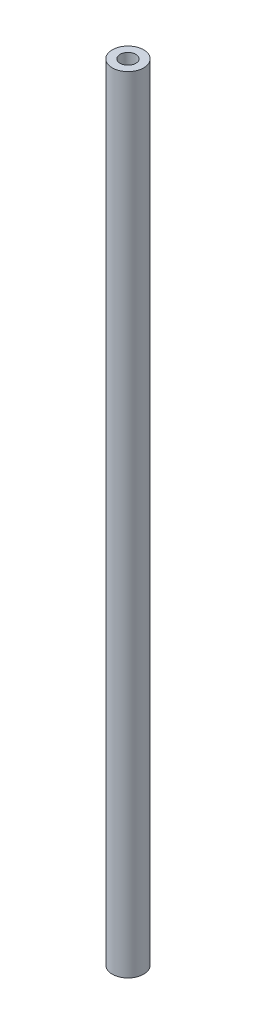
ISO-10303-21;
HEADER;
FILE_DESCRIPTION(('STEP AP214'),'2;1');
FILE_NAME('part.step','',(''),(''),'','','');
FILE_SCHEMA(('AUTOMOTIVE_DESIGN { 1 0 10303 214 1 1 1 1 }'));
ENDSEC;
DATA;
#1=APPLICATION_CONTEXT('core data for automotive mechanical design processes');
#2=APPLICATION_PROTOCOL_DEFINITION('international standard','automotive_design',2000,#1);
#3=PRODUCT_CONTEXT('',#1,'mechanical');
#4=PRODUCT('Part','Part','',(#3));
#5=PRODUCT_RELATED_PRODUCT_CATEGORY('part','',(#4));
#6=PRODUCT_DEFINITION_FORMATION('','',#4);
#7=PRODUCT_DEFINITION_CONTEXT('part definition',#1,'design');
#8=PRODUCT_DEFINITION('design','',#6,#7);
#9=PRODUCT_DEFINITION_SHAPE('','',#8);
#10=(LENGTH_UNIT() NAMED_UNIT(*) SI_UNIT(.MILLI.,.METRE.));
#11=(NAMED_UNIT(*) PLANE_ANGLE_UNIT() SI_UNIT($,.RADIAN.));
#12=(NAMED_UNIT(*) SI_UNIT($,.STERADIAN.) SOLID_ANGLE_UNIT());
#13=UNCERTAINTY_MEASURE_WITH_UNIT(LENGTH_MEASURE(1.E-05),#10,'distance_accuracy_value','');
#14=(GEOMETRIC_REPRESENTATION_CONTEXT(3) GLOBAL_UNCERTAINTY_ASSIGNED_CONTEXT((#13)) GLOBAL_UNIT_ASSIGNED_CONTEXT((#10,
#11,#12)) REPRESENTATION_CONTEXT('',''));
#15=CARTESIAN_POINT('',(0.,0.,0.));
#16=DIRECTION('',(0.,0.,1.));
#17=DIRECTION('',(1.,0.,0.));
#18=AXIS2_PLACEMENT_3D('',#15,#16,#17);
#19=CARTESIAN_POINT('',(0.,150.,0.));
#20=DIRECTION('',(0.,-1.,0.));
#21=DIRECTION('',(0.,0.,-1.));
#22=AXIS2_PLACEMENT_3D('',#19,#20,#21);
#23=CYLINDRICAL_SURFACE('',#22,3.);
#24=CARTESIAN_POINT('',(0.,150.,0.));
#25=DIRECTION('',(0.,1.,0.));
#26=DIRECTION('',(0.,0.,1.));
#27=AXIS2_PLACEMENT_3D('',#24,#25,#26);
#28=CIRCLE('',#27,3.);
#29=CARTESIAN_POINT('',(0.,150.,3.));
#30=VERTEX_POINT('',#29);
#31=EDGE_CURVE('E10',#30,#30,#28,.T.);
#32=ORIENTED_EDGE('',*,*,#31,.F.);
#33=EDGE_LOOP('',(#32));
#34=FACE_BOUND('',#33,.T.);
#35=CARTESIAN_POINT('',(0.,0.,0.));
#36=DIRECTION('',(0.,1.,0.));
#37=DIRECTION('',(0.,0.,1.));
#38=AXIS2_PLACEMENT_3D('',#35,#36,#37);
#39=CIRCLE('',#38,3.);
#40=CARTESIAN_POINT('',(0.,0.,3.));
#41=VERTEX_POINT('',#40);
#42=EDGE_CURVE('E39',#41,#41,#39,.T.);
#43=ORIENTED_EDGE('',*,*,#42,.T.);
#44=EDGE_LOOP('',(#43));
#45=FACE_BOUND('',#44,.T.);
#46=ADVANCED_FACE('F36',(#34,#45),#23,.T.);
#47=CARTESIAN_POINT('',(0.,150.,0.));
#48=DIRECTION('',(0.,1.,0.));
#49=DIRECTION('',(0.,0.,1.));
#50=AXIS2_PLACEMENT_3D('',#47,#48,#49);
#51=PLANE('',#50);
#52=CARTESIAN_POINT('',(0.,150.,0.));
#53=DIRECTION('',(0.,1.,0.));
#54=DIRECTION('',(0.,0.,1.));
#55=AXIS2_PLACEMENT_3D('',#52,#53,#54);
#56=CIRCLE('',#55,1.5);
#57=CARTESIAN_POINT('',(0.,150.,1.5));
#58=VERTEX_POINT('',#57);
#59=EDGE_CURVE('E50',#58,#58,#56,.T.);
#60=ORIENTED_EDGE('',*,*,#59,.F.);
#61=EDGE_LOOP('',(#60));
#62=FACE_BOUND('',#61,.T.);
#63=ORIENTED_EDGE('',*,*,#31,.T.);
#64=EDGE_LOOP('',(#63));
#65=FACE_BOUND('',#64,.T.);
#66=ADVANCED_FACE('F79',(#62,#65),#51,.T.);
#67=CARTESIAN_POINT('',(0.,0.,0.));
#68=DIRECTION('',(0.,1.,0.));
#69=DIRECTION('',(0.,0.,1.));
#70=AXIS2_PLACEMENT_3D('',#67,#68,#69);
#71=PLANE('',#70);
#72=CARTESIAN_POINT('',(0.,0.,0.));
#73=DIRECTION('',(0.,-1.,0.));
#74=DIRECTION('',(0.,0.,-1.));
#75=AXIS2_PLACEMENT_3D('',#72,#73,#74);
#76=CIRCLE('',#75,1.5);
#77=CARTESIAN_POINT('',(0.,0.,-1.5));
#78=VERTEX_POINT('',#77);
#79=EDGE_CURVE('E58',#78,#78,#76,.T.);
#80=ORIENTED_EDGE('',*,*,#79,.F.);
#81=EDGE_LOOP('',(#80));
#82=FACE_BOUND('',#81,.T.);
#83=ORIENTED_EDGE('',*,*,#42,.F.);
#84=EDGE_LOOP('',(#83));
#85=FACE_BOUND('',#84,.T.);
#86=ADVANCED_FACE('F75',(#82,#85),#71,.F.);
#87=CARTESIAN_POINT('',(0.,140.,0.));
#88=DIRECTION('',(0.,1.,0.));
#89=DIRECTION('',(0.,0.,1.));
#90=AXIS2_PLACEMENT_3D('',#87,#88,#89);
#91=CYLINDRICAL_SURFACE('',#90,1.5);
#92=CARTESIAN_POINT('',(0.,140.,0.));
#93=DIRECTION('',(0.,1.,0.));
#94=DIRECTION('',(0.,0.,1.));
#95=AXIS2_PLACEMENT_3D('',#92,#93,#94);
#96=CIRCLE('',#95,1.5);
#97=CARTESIAN_POINT('',(0.,140.,1.5));
#98=VERTEX_POINT('',#97);
#99=EDGE_CURVE('E48',#98,#98,#96,.T.);
#100=ORIENTED_EDGE('',*,*,#99,.F.);
#101=EDGE_LOOP('',(#100));
#102=FACE_BOUND('',#101,.T.);
#103=ORIENTED_EDGE('',*,*,#59,.T.);
#104=EDGE_LOOP('',(#103));
#105=FACE_BOUND('',#104,.T.);
#106=ADVANCED_FACE('F78',(#102,#105),#91,.F.);
#107=CARTESIAN_POINT('',(0.,140.,0.));
#108=DIRECTION('',(0.,1.,0.));
#109=DIRECTION('',(0.,0.,1.));
#110=AXIS2_PLACEMENT_3D('',#107,#108,#109);
#111=PLANE('',#110);
#112=ORIENTED_EDGE('',*,*,#99,.T.);
#113=EDGE_LOOP('',(#112));
#114=FACE_BOUND('',#113,.T.);
#115=ADVANCED_FACE('F71',(#114),#111,.T.);
#116=CARTESIAN_POINT('',(0.,10.,0.));
#117=DIRECTION('',(0.,-1.,0.));
#118=DIRECTION('',(0.,0.,-1.));
#119=AXIS2_PLACEMENT_3D('',#116,#117,#118);
#120=CYLINDRICAL_SURFACE('',#119,1.5);
#121=CARTESIAN_POINT('',(0.,10.,0.));
#122=DIRECTION('',(0.,-1.,0.));
#123=DIRECTION('',(0.,0.,-1.));
#124=AXIS2_PLACEMENT_3D('',#121,#122,#123);
#125=CIRCLE('',#124,1.5);
#126=CARTESIAN_POINT('',(0.,10.,-1.5));
#127=VERTEX_POINT('',#126);
#128=EDGE_CURVE('E54',#127,#127,#125,.T.);
#129=ORIENTED_EDGE('',*,*,#128,.F.);
#130=EDGE_LOOP('',(#129));
#131=FACE_BOUND('',#130,.T.);
#132=ORIENTED_EDGE('',*,*,#79,.T.);
#133=EDGE_LOOP('',(#132));
#134=FACE_BOUND('',#133,.T.);
#135=ADVANCED_FACE('F68',(#131,#134),#120,.F.);
#136=CARTESIAN_POINT('',(0.,10.,0.));
#137=DIRECTION('',(0.,-1.,0.));
#138=DIRECTION('',(0.,0.,-1.));
#139=AXIS2_PLACEMENT_3D('',#136,#137,#138);
#140=PLANE('',#139);
#141=ORIENTED_EDGE('',*,*,#128,.T.);
#142=EDGE_LOOP('',(#141));
#143=FACE_BOUND('',#142,.T.);
#144=ADVANCED_FACE('F66',(#143),#140,.T.);
#145=CLOSED_SHELL('',(#46,#66,#86,#106,#115,#135,#144));
#146=MANIFOLD_SOLID_BREP('B2',#145);
#147=ADVANCED_BREP_SHAPE_REPRESENTATION('',(#18,#146),#14);
#148=SHAPE_DEFINITION_REPRESENTATION(#9,#147);
ENDSEC;
END-ISO-10303-21;
